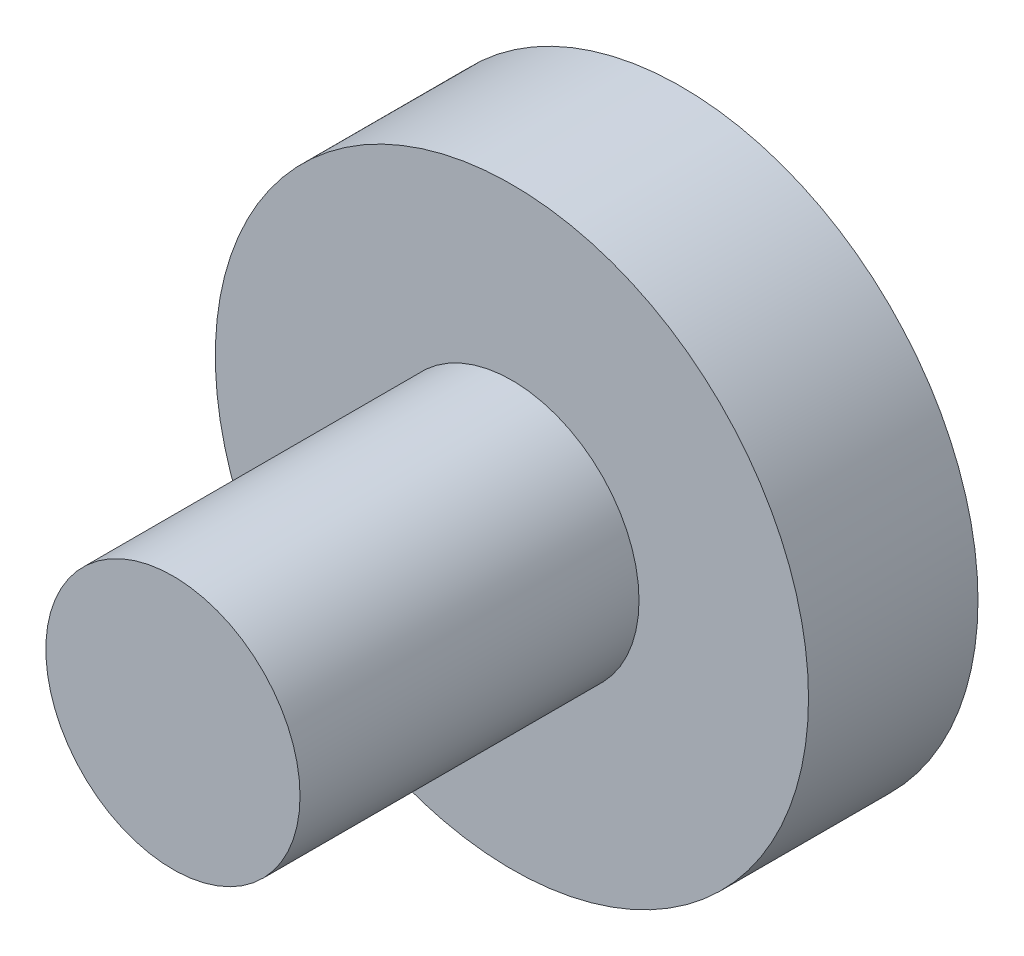
ISO-10303-21;
HEADER;
FILE_DESCRIPTION(('STEP AP214'),'2;1');
FILE_NAME('part.step','',(''),(''),'','','');
FILE_SCHEMA(('AUTOMOTIVE_DESIGN { 1 0 10303 214 1 1 1 1 }'));
ENDSEC;
DATA;
#1=APPLICATION_CONTEXT('core data for automotive mechanical design processes');
#2=APPLICATION_PROTOCOL_DEFINITION('international standard','automotive_design',2000,#1);
#3=PRODUCT_CONTEXT('',#1,'mechanical');
#4=PRODUCT('Part','Part','',(#3));
#5=PRODUCT_RELATED_PRODUCT_CATEGORY('part','',(#4));
#6=PRODUCT_DEFINITION_FORMATION('','',#4);
#7=PRODUCT_DEFINITION_CONTEXT('part definition',#1,'design');
#8=PRODUCT_DEFINITION('design','',#6,#7);
#9=PRODUCT_DEFINITION_SHAPE('','',#8);
#10=(LENGTH_UNIT() NAMED_UNIT(*) SI_UNIT(.MILLI.,.METRE.));
#11=(NAMED_UNIT(*) PLANE_ANGLE_UNIT() SI_UNIT($,.RADIAN.));
#12=(NAMED_UNIT(*) SI_UNIT($,.STERADIAN.) SOLID_ANGLE_UNIT());
#13=UNCERTAINTY_MEASURE_WITH_UNIT(LENGTH_MEASURE(1.E-05),#10,'distance_accuracy_value','');
#14=(GEOMETRIC_REPRESENTATION_CONTEXT(3) GLOBAL_UNCERTAINTY_ASSIGNED_CONTEXT((#13)) GLOBAL_UNIT_ASSIGNED_CONTEXT((#10,
#11,#12)) REPRESENTATION_CONTEXT('',''));
#15=CARTESIAN_POINT('',(0.,0.,0.));
#16=DIRECTION('',(0.,0.,1.));
#17=DIRECTION('',(1.,0.,0.));
#18=AXIS2_PLACEMENT_3D('',#15,#16,#17);
#19=CARTESIAN_POINT('',(0.,0.,2.));
#20=DIRECTION('',(0.,0.,-1.));
#21=DIRECTION('',(-1.,0.,0.));
#22=AXIS2_PLACEMENT_3D('',#19,#20,#21);
#23=CYLINDRICAL_SURFACE('',#22,3.5);
#24=CARTESIAN_POINT('',(0.,0.,2.));
#25=DIRECTION('',(0.,0.,1.));
#26=DIRECTION('',(1.,0.,0.));
#27=AXIS2_PLACEMENT_3D('',#24,#25,#26);
#28=CIRCLE('',#27,3.5);
#29=CARTESIAN_POINT('',(3.5,0.,2.));
#30=VERTEX_POINT('',#29);
#31=EDGE_CURVE('E45',#30,#30,#28,.T.);
#32=ORIENTED_EDGE('',*,*,#31,.F.);
#33=EDGE_LOOP('',(#32));
#34=FACE_BOUND('',#33,.T.);
#35=CARTESIAN_POINT('',(0.,0.,0.));
#36=DIRECTION('',(0.,0.,1.));
#37=DIRECTION('',(1.,0.,0.));
#38=AXIS2_PLACEMENT_3D('',#35,#36,#37);
#39=CIRCLE('',#38,3.5);
#40=CARTESIAN_POINT('',(3.5,0.,0.));
#41=VERTEX_POINT('',#40);
#42=EDGE_CURVE('E40',#41,#41,#39,.T.);
#43=ORIENTED_EDGE('',*,*,#42,.T.);
#44=EDGE_LOOP('',(#43));
#45=FACE_BOUND('',#44,.T.);
#46=ADVANCED_FACE('F37',(#34,#45),#23,.T.);
#47=CARTESIAN_POINT('',(0.,0.,2.));
#48=DIRECTION('',(0.,0.,1.));
#49=DIRECTION('',(1.,0.,0.));
#50=AXIS2_PLACEMENT_3D('',#47,#48,#49);
#51=PLANE('',#50);
#52=CARTESIAN_POINT('',(0.,0.,2.));
#53=DIRECTION('',(0.,0.,1.));
#54=DIRECTION('',(1.,0.,0.));
#55=AXIS2_PLACEMENT_3D('',#52,#53,#54);
#56=CIRCLE('',#55,1.5);
#57=CARTESIAN_POINT('',(1.5,0.,2.));
#58=VERTEX_POINT('',#57);
#59=EDGE_CURVE('E10',#58,#58,#56,.T.);
#60=ORIENTED_EDGE('',*,*,#59,.F.);
#61=EDGE_LOOP('',(#60));
#62=FACE_BOUND('',#61,.T.);
#63=ORIENTED_EDGE('',*,*,#31,.T.);
#64=EDGE_LOOP('',(#63));
#65=FACE_BOUND('',#64,.T.);
#66=ADVANCED_FACE('F65',(#62,#65),#51,.T.);
#67=CARTESIAN_POINT('',(0.,0.,0.));
#68=DIRECTION('',(0.,0.,1.));
#69=DIRECTION('',(1.,0.,0.));
#70=AXIS2_PLACEMENT_3D('',#67,#68,#69);
#71=PLANE('',#70);
#72=ORIENTED_EDGE('',*,*,#42,.F.);
#73=EDGE_LOOP('',(#72));
#74=FACE_BOUND('',#73,.T.);
#75=ADVANCED_FACE('F62',(#74),#71,.F.);
#76=CARTESIAN_POINT('',(0.,0.,6.));
#77=DIRECTION('',(0.,0.,-1.));
#78=DIRECTION('',(-1.,0.,0.));
#79=AXIS2_PLACEMENT_3D('',#76,#77,#78);
#80=CYLINDRICAL_SURFACE('',#79,1.5);
#81=CARTESIAN_POINT('',(0.,0.,6.));
#82=DIRECTION('',(0.,0.,1.));
#83=DIRECTION('',(1.,0.,0.));
#84=AXIS2_PLACEMENT_3D('',#81,#82,#83);
#85=CIRCLE('',#84,1.5);
#86=CARTESIAN_POINT('',(1.5,0.,6.));
#87=VERTEX_POINT('',#86);
#88=EDGE_CURVE('E52',#87,#87,#85,.T.);
#89=ORIENTED_EDGE('',*,*,#88,.F.);
#90=EDGE_LOOP('',(#89));
#91=FACE_BOUND('',#90,.T.);
#92=ORIENTED_EDGE('',*,*,#59,.T.);
#93=EDGE_LOOP('',(#92));
#94=FACE_BOUND('',#93,.T.);
#95=ADVANCED_FACE('F64',(#91,#94),#80,.T.);
#96=CARTESIAN_POINT('',(0.,0.,6.));
#97=DIRECTION('',(0.,0.,1.));
#98=DIRECTION('',(1.,0.,0.));
#99=AXIS2_PLACEMENT_3D('',#96,#97,#98);
#100=PLANE('',#99);
#101=ORIENTED_EDGE('',*,*,#88,.T.);
#102=EDGE_LOOP('',(#101));
#103=FACE_BOUND('',#102,.T.);
#104=ADVANCED_FACE('F70',(#103),#100,.T.);
#105=CLOSED_SHELL('',(#46,#66,#75,#95,#104));
#106=MANIFOLD_SOLID_BREP('B2',#105);
#107=ADVANCED_BREP_SHAPE_REPRESENTATION('',(#18,#106),#14);
#108=SHAPE_DEFINITION_REPRESENTATION(#9,#107);
ENDSEC;
END-ISO-10303-21;
